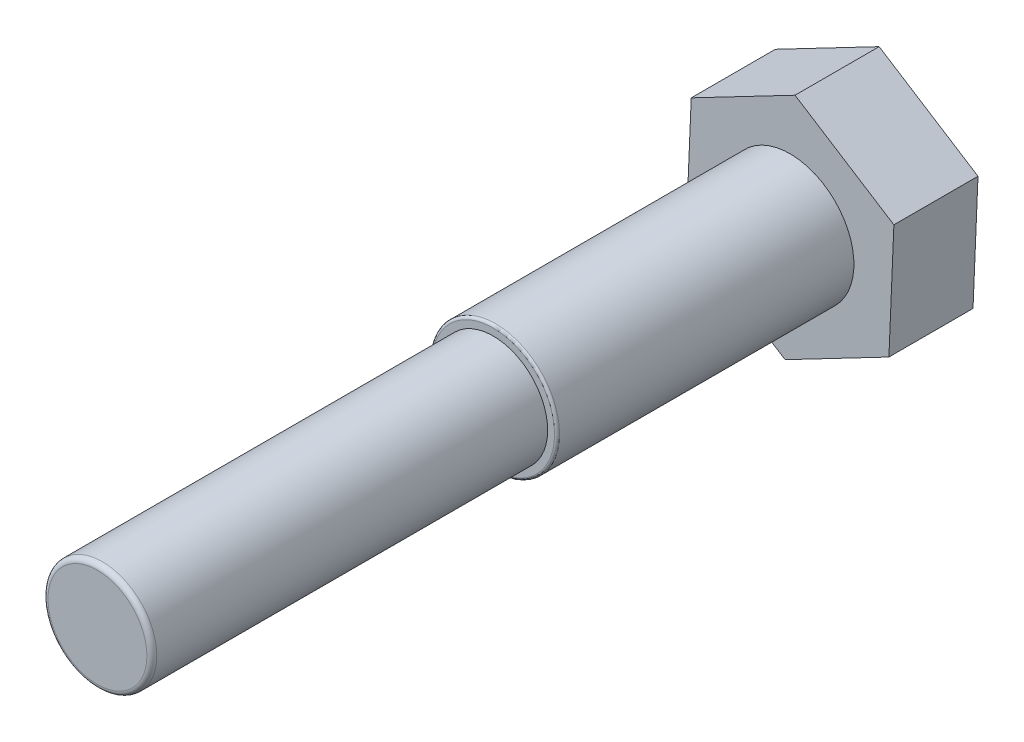
ISO-10303-21;
HEADER;
FILE_DESCRIPTION(('STEP AP214'),'2;1');
FILE_NAME('part.step','',(''),(''),'','','');
FILE_SCHEMA(('AUTOMOTIVE_DESIGN { 1 0 10303 214 1 1 1 1 }'));
ENDSEC;
DATA;
#1=APPLICATION_CONTEXT('core data for automotive mechanical design processes');
#2=APPLICATION_PROTOCOL_DEFINITION('international standard','automotive_design',2000,#1);
#3=PRODUCT_CONTEXT('',#1,'mechanical');
#4=PRODUCT('Part','Part','',(#3));
#5=PRODUCT_RELATED_PRODUCT_CATEGORY('part','',(#4));
#6=PRODUCT_DEFINITION_FORMATION('','',#4);
#7=PRODUCT_DEFINITION_CONTEXT('part definition',#1,'design');
#8=PRODUCT_DEFINITION('design','',#6,#7);
#9=PRODUCT_DEFINITION_SHAPE('','',#8);
#10=(LENGTH_UNIT() NAMED_UNIT(*) SI_UNIT(.MILLI.,.METRE.));
#11=(NAMED_UNIT(*) PLANE_ANGLE_UNIT() SI_UNIT($,.RADIAN.));
#12=(NAMED_UNIT(*) SI_UNIT($,.STERADIAN.) SOLID_ANGLE_UNIT());
#13=UNCERTAINTY_MEASURE_WITH_UNIT(LENGTH_MEASURE(1.E-05),#10,'distance_accuracy_value','');
#14=(GEOMETRIC_REPRESENTATION_CONTEXT(3) GLOBAL_UNCERTAINTY_ASSIGNED_CONTEXT((#13)) GLOBAL_UNIT_ASSIGNED_CONTEXT((#10,
#11,#12)) REPRESENTATION_CONTEXT('',''));
#15=CARTESIAN_POINT('',(0.,0.,0.));
#16=DIRECTION('',(0.,0.,1.));
#17=DIRECTION('',(1.,0.,0.));
#18=AXIS2_PLACEMENT_3D('',#15,#16,#17);
#19=CARTESIAN_POINT('',(19.9787997617734,-12.6957037383635,17.));
#20=DIRECTION('',(-0.999097599975706,0.0424733530909036,0.));
#21=DIRECTION('',(-0.0424733530909036,-0.999097599975706,0.));
#22=AXIS2_PLACEMENT_3D('',#19,#20,#21);
#23=PLANE('',#22);
#24=DIRECTION('',(0.0424733530909036,0.999097599975706,0.));
#25=VECTOR('',#24,1.);
#26=CARTESIAN_POINT('',(19.9787997617734,-12.6957037383635,0.));
#27=LINE('',#26,#25);
#28=CARTESIAN_POINT('',(19.9787997617734,-12.6957037383635,0.));
#29=VERTEX_POINT('',#28);
#30=CARTESIAN_POINT('',(20.9842018372306,10.9542962616365,0.));
#31=VERTEX_POINT('',#30);
#32=EDGE_CURVE('E122',#29,#31,#27,.T.);
#33=ORIENTED_EDGE('',*,*,#32,.T.);
#34=DIRECTION('',(0.,0.,-1.));
#35=VECTOR('',#34,1.);
#36=CARTESIAN_POINT('',(20.9842018372306,10.9542962616365,17.));
#37=LINE('',#36,#35);
#38=CARTESIAN_POINT('',(20.9842018372306,10.9542962616365,17.));
#39=VERTEX_POINT('',#38);
#40=EDGE_CURVE('E140',#39,#31,#37,.T.);
#41=ORIENTED_EDGE('',*,*,#40,.F.);
#42=DIRECTION('',(0.0424733530909036,0.999097599975706,0.));
#43=VECTOR('',#42,1.);
#44=CARTESIAN_POINT('',(19.9787997617734,-12.6957037383635,17.));
#45=LINE('',#44,#43);
#46=CARTESIAN_POINT('',(19.9787997617734,-12.6957037383635,17.));
#47=VERTEX_POINT('',#46);
#48=EDGE_CURVE('E133',#47,#39,#45,.T.);
#49=ORIENTED_EDGE('',*,*,#48,.F.);
#50=DIRECTION('',(0.,0.,-1.));
#51=VECTOR('',#50,1.);
#52=CARTESIAN_POINT('',(19.9787997617734,-12.6957037383635,17.));
#53=LINE('',#52,#51);
#54=EDGE_CURVE('E118',#47,#29,#53,.T.);
#55=ORIENTED_EDGE('',*,*,#54,.T.);
#56=EDGE_LOOP('',(#33,#41,#49,#55));
#57=FACE_BOUND('',#56,.T.);
#58=ADVANCED_FACE('F36',(#57),#23,.F.);
#59=CARTESIAN_POINT('',(20.9842018372306,10.9542962616365,17.));
#60=DIRECTION('',(-0.536331802748482,-0.844007225893572,0.));
#61=DIRECTION('',(0.844007225893572,-0.536331802748482,0.));
#62=AXIS2_PLACEMENT_3D('',#59,#60,#61);
#63=PLANE('',#62);
#64=DIRECTION('',(-0.844007225893572,0.536331802748482,0.));
#65=VECTOR('',#64,1.);
#66=CARTESIAN_POINT('',(20.9842018372306,10.9542962616365,0.));
#67=LINE('',#66,#65);
#68=CARTESIAN_POINT('',(1.0054020754572,23.65,0.));
#69=VERTEX_POINT('',#68);
#70=EDGE_CURVE('E125',#31,#69,#67,.T.);
#71=ORIENTED_EDGE('',*,*,#70,.T.);
#72=DIRECTION('',(0.,0.,-1.));
#73=VECTOR('',#72,1.);
#74=CARTESIAN_POINT('',(1.0054020754572,23.65,17.));
#75=LINE('',#74,#73);
#76=CARTESIAN_POINT('',(1.0054020754572,23.65,17.));
#77=VERTEX_POINT('',#76);
#78=EDGE_CURVE('E137',#77,#69,#75,.T.);
#79=ORIENTED_EDGE('',*,*,#78,.F.);
#80=DIRECTION('',(-0.844007225893572,0.536331802748482,0.));
#81=VECTOR('',#80,1.);
#82=CARTESIAN_POINT('',(20.9842018372306,10.9542962616365,17.));
#83=LINE('',#82,#81);
#84=EDGE_CURVE('E91',#39,#77,#83,.T.);
#85=ORIENTED_EDGE('',*,*,#84,.F.);
#86=ORIENTED_EDGE('',*,*,#40,.T.);
#87=EDGE_LOOP('',(#71,#79,#85,#86));
#88=FACE_BOUND('',#87,.T.);
#89=ADVANCED_FACE('F166',(#88),#63,.F.);
#90=CARTESIAN_POINT('',(1.0054020754572,23.65,17.));
#91=DIRECTION('',(0.462765797227231,-0.886480578984472,0.));
#92=DIRECTION('',(0.886480578984472,0.462765797227231,0.));
#93=AXIS2_PLACEMENT_3D('',#90,#91,#92);
#94=PLANE('',#93);
#95=DIRECTION('',(-0.886480578984472,-0.462765797227231,0.));
#96=VECTOR('',#95,1.);
#97=CARTESIAN_POINT('',(1.0054020754572,23.65,0.));
#98=LINE('',#97,#96);
#99=CARTESIAN_POINT('',(-19.9787997617736,12.6957037383632,0.));
#100=VERTEX_POINT('',#99);
#101=EDGE_CURVE('E128',#69,#100,#98,.T.);
#102=ORIENTED_EDGE('',*,*,#101,.T.);
#103=DIRECTION('',(0.,0.,-1.));
#104=VECTOR('',#103,1.);
#105=CARTESIAN_POINT('',(-19.9787997617736,12.6957037383632,17.));
#106=LINE('',#105,#104);
#107=CARTESIAN_POINT('',(-19.9787997617736,12.6957037383632,17.));
#108=VERTEX_POINT('',#107);
#109=EDGE_CURVE('E113',#108,#100,#106,.T.);
#110=ORIENTED_EDGE('',*,*,#109,.F.);
#111=DIRECTION('',(-0.886480578984472,-0.462765797227231,0.));
#112=VECTOR('',#111,1.);
#113=CARTESIAN_POINT('',(1.0054020754572,23.65,17.));
#114=LINE('',#113,#112);
#115=EDGE_CURVE('E104',#77,#108,#114,.T.);
#116=ORIENTED_EDGE('',*,*,#115,.F.);
#117=ORIENTED_EDGE('',*,*,#78,.T.);
#118=EDGE_LOOP('',(#102,#110,#116,#117));
#119=FACE_BOUND('',#118,.T.);
#120=ADVANCED_FACE('F172',(#119),#94,.F.);
#121=CARTESIAN_POINT('',(-19.9787997617736,12.6957037383632,17.));
#122=DIRECTION('',(0.999097599975706,-0.0424733530908878,0.));
#123=DIRECTION('',(0.0424733530908878,0.999097599975707,0.));
#124=AXIS2_PLACEMENT_3D('',#121,#122,#123);
#125=PLANE('',#124);
#126=DIRECTION('',(-0.0424733530908878,-0.999097599975706,0.));
#127=VECTOR('',#126,1.);
#128=CARTESIAN_POINT('',(-19.9787997617736,12.6957037383632,0.));
#129=LINE('',#128,#127);
#130=CARTESIAN_POINT('',(-20.9842018372304,-10.9542962616368,0.));
#131=VERTEX_POINT('',#130);
#132=EDGE_CURVE('E112',#100,#131,#129,.T.);
#133=ORIENTED_EDGE('',*,*,#132,.T.);
#134=DIRECTION('',(0.,0.,-1.));
#135=VECTOR('',#134,1.);
#136=CARTESIAN_POINT('',(-20.9842018372304,-10.9542962616368,17.));
#137=LINE('',#136,#135);
#138=CARTESIAN_POINT('',(-20.9842018372304,-10.9542962616368,17.));
#139=VERTEX_POINT('',#138);
#140=EDGE_CURVE('E109',#139,#131,#137,.T.);
#141=ORIENTED_EDGE('',*,*,#140,.F.);
#142=DIRECTION('',(-0.0424733530908878,-0.999097599975706,0.));
#143=VECTOR('',#142,1.);
#144=CARTESIAN_POINT('',(-19.9787997617736,12.6957037383632,17.));
#145=LINE('',#144,#143);
#146=EDGE_CURVE('E98',#108,#139,#145,.T.);
#147=ORIENTED_EDGE('',*,*,#146,.F.);
#148=ORIENTED_EDGE('',*,*,#109,.T.);
#149=EDGE_LOOP('',(#133,#141,#147,#148));
#150=FACE_BOUND('',#149,.T.);
#151=ADVANCED_FACE('F110',(#150),#125,.F.);
#152=CARTESIAN_POINT('',(-20.9842018372304,-10.9542962616368,17.));
#153=DIRECTION('',(0.536331802748476,0.844007225893576,0.));
#154=DIRECTION('',(-0.844007225893576,0.536331802748476,0.));
#155=AXIS2_PLACEMENT_3D('',#152,#153,#154);
#156=PLANE('',#155);
#157=DIRECTION('',(0.844007225893576,-0.536331802748476,0.));
#158=VECTOR('',#157,1.);
#159=CARTESIAN_POINT('',(-20.9842018372304,-10.9542962616368,0.));
#160=LINE('',#159,#158);
#161=CARTESIAN_POINT('',(-1.00540207545719,-23.65,0.));
#162=VERTEX_POINT('',#161);
#163=EDGE_CURVE('E76',#131,#162,#160,.T.);
#164=ORIENTED_EDGE('',*,*,#163,.T.);
#165=DIRECTION('',(0.,0.,-1.));
#166=VECTOR('',#165,1.);
#167=CARTESIAN_POINT('',(-1.00540207545719,-23.65,17.));
#168=LINE('',#167,#166);
#169=CARTESIAN_POINT('',(-1.00540207545719,-23.65,17.));
#170=VERTEX_POINT('',#169);
#171=EDGE_CURVE('E114',#170,#162,#168,.T.);
#172=ORIENTED_EDGE('',*,*,#171,.F.);
#173=DIRECTION('',(0.844007225893576,-0.536331802748476,0.));
#174=VECTOR('',#173,1.);
#175=CARTESIAN_POINT('',(-20.9842018372304,-10.9542962616368,17.));
#176=LINE('',#175,#174);
#177=EDGE_CURVE('E102',#139,#170,#176,.T.);
#178=ORIENTED_EDGE('',*,*,#177,.F.);
#179=ORIENTED_EDGE('',*,*,#140,.T.);
#180=EDGE_LOOP('',(#164,#172,#178,#179));
#181=FACE_BOUND('',#180,.T.);
#182=ADVANCED_FACE('F116',(#181),#156,.F.);
#183=CARTESIAN_POINT('',(-1.00540207545719,-23.65,17.));
#184=DIRECTION('',(-0.462765797227224,0.886480578984476,0.));
#185=DIRECTION('',(-0.886480578984476,-0.462765797227224,0.));
#186=AXIS2_PLACEMENT_3D('',#183,#184,#185);
#187=PLANE('',#186);
#188=DIRECTION('',(0.886480578984476,0.462765797227224,0.));
#189=VECTOR('',#188,1.);
#190=CARTESIAN_POINT('',(-1.00540207545719,-23.65,0.));
#191=LINE('',#190,#189);
#192=EDGE_CURVE('E82',#162,#29,#191,.T.);
#193=ORIENTED_EDGE('',*,*,#192,.T.);
#194=ORIENTED_EDGE('',*,*,#54,.F.);
#195=DIRECTION('',(0.886480578984476,0.462765797227224,0.));
#196=VECTOR('',#195,1.);
#197=CARTESIAN_POINT('',(-1.00540207545719,-23.65,17.));
#198=LINE('',#197,#196);
#199=EDGE_CURVE('E53',#170,#47,#198,.T.);
#200=ORIENTED_EDGE('',*,*,#199,.F.);
#201=ORIENTED_EDGE('',*,*,#171,.T.);
#202=EDGE_LOOP('',(#193,#194,#200,#201));
#203=FACE_BOUND('',#202,.T.);
#204=ADVANCED_FACE('F182',(#203),#187,.F.);
#205=CARTESIAN_POINT('',(18.9733976863162,-36.3457037383633,17.));
#206=DIRECTION('',(0.,0.,-1.));
#207=DIRECTION('',(-1.,0.,0.));
#208=AXIS2_PLACEMENT_3D('',#205,#206,#207);
#209=PLANE('',#208);
#210=CARTESIAN_POINT('',(0.,0.,17.));
#211=DIRECTION('',(0.,0.,-1.));
#212=DIRECTION('',(-1.,0.,0.));
#213=AXIS2_PLACEMENT_3D('',#210,#211,#212);
#214=CIRCLE('',#213,12.9);
#215=CARTESIAN_POINT('',(-12.9,0.,17.));
#216=VERTEX_POINT('',#215);
#217=EDGE_CURVE('E142',#216,#216,#214,.F.);
#218=ORIENTED_EDGE('',*,*,#217,.F.);
#219=EDGE_LOOP('',(#218));
#220=FACE_BOUND('',#219,.T.);
#221=ORIENTED_EDGE('',*,*,#48,.T.);
#222=ORIENTED_EDGE('',*,*,#84,.T.);
#223=ORIENTED_EDGE('',*,*,#115,.T.);
#224=ORIENTED_EDGE('',*,*,#146,.T.);
#225=ORIENTED_EDGE('',*,*,#177,.T.);
#226=ORIENTED_EDGE('',*,*,#199,.T.);
#227=EDGE_LOOP('',(#221,#222,#223,#224,#225,#226));
#228=FACE_BOUND('',#227,.T.);
#229=ADVANCED_FACE('F100',(#220,#228),#209,.F.);
#230=CARTESIAN_POINT('',(18.9733976863162,-36.3457037383633,0.));
#231=DIRECTION('',(0.,0.,-1.));
#232=DIRECTION('',(-1.,0.,0.));
#233=AXIS2_PLACEMENT_3D('',#230,#231,#232);
#234=PLANE('',#233);
#235=ORIENTED_EDGE('',*,*,#32,.F.);
#236=ORIENTED_EDGE('',*,*,#192,.F.);
#237=ORIENTED_EDGE('',*,*,#163,.F.);
#238=ORIENTED_EDGE('',*,*,#132,.F.);
#239=ORIENTED_EDGE('',*,*,#101,.F.);
#240=ORIENTED_EDGE('',*,*,#70,.F.);
#241=EDGE_LOOP('',(#235,#236,#237,#238,#239,#240));
#242=FACE_BOUND('',#241,.T.);
#243=ADVANCED_FACE('F185',(#242),#234,.T.);
#244=CARTESIAN_POINT('',(0.,0.,77.));
#245=DIRECTION('',(0.,0.,-1.));
#246=DIRECTION('',(-1.,0.,0.));
#247=AXIS2_PLACEMENT_3D('',#244,#245,#246);
#248=CYLINDRICAL_SURFACE('',#247,12.9);
#249=CARTESIAN_POINT('',(0.,0.,76.5));
#250=DIRECTION('',(0.,0.,1.));
#251=DIRECTION('',(1.,0.,0.));
#252=AXIS2_PLACEMENT_3D('',#249,#250,#251);
#253=CIRCLE('',#252,12.9);
#254=CARTESIAN_POINT('',(12.9,0.,76.5));
#255=VERTEX_POINT('',#254);
#256=EDGE_CURVE('E11',#255,#255,#253,.F.);
#257=ORIENTED_EDGE('',*,*,#256,.T.);
#258=EDGE_LOOP('',(#257));
#259=FACE_BOUND('',#258,.T.);
#260=ORIENTED_EDGE('',*,*,#217,.T.);
#261=EDGE_LOOP('',(#260));
#262=FACE_BOUND('',#261,.T.);
#263=ADVANCED_FACE('F188',(#259,#262),#248,.T.);
#264=CARTESIAN_POINT('',(0.,0.,77.));
#265=DIRECTION('',(0.,0.,1.));
#266=DIRECTION('',(1.,0.,0.));
#267=AXIS2_PLACEMENT_3D('',#264,#265,#266);
#268=PLANE('',#267);
#269=CARTESIAN_POINT('',(0.,0.,77.));
#270=DIRECTION('',(0.,0.,1.));
#271=DIRECTION('',(1.,0.,0.));
#272=AXIS2_PLACEMENT_3D('',#269,#270,#271);
#273=CIRCLE('',#272,12.4);
#274=CARTESIAN_POINT('',(12.4,0.,77.));
#275=VERTEX_POINT('',#274);
#276=EDGE_CURVE('E45',#275,#275,#273,.T.);
#277=ORIENTED_EDGE('',*,*,#276,.T.);
#278=EDGE_LOOP('',(#277));
#279=FACE_BOUND('',#278,.T.);
#280=CARTESIAN_POINT('',(0.,0.,77.));
#281=DIRECTION('',(0.,0.,1.));
#282=DIRECTION('',(1.,0.,0.));
#283=AXIS2_PLACEMENT_3D('',#280,#281,#282);
#284=CIRCLE('',#283,11.);
#285=CARTESIAN_POINT('',(11.,0.,77.));
#286=VERTEX_POINT('',#285);
#287=EDGE_CURVE('E126',#286,#286,#284,.T.);
#288=ORIENTED_EDGE('',*,*,#287,.F.);
#289=EDGE_LOOP('',(#288));
#290=FACE_BOUND('',#289,.T.);
#291=ADVANCED_FACE('F153',(#279,#290),#268,.T.);
#292=CARTESIAN_POINT('',(0.,0.,157.));
#293=DIRECTION('',(0.,0.,-1.));
#294=DIRECTION('',(-1.,0.,0.));
#295=AXIS2_PLACEMENT_3D('',#292,#293,#294);
#296=CYLINDRICAL_SURFACE('',#295,11.);
#297=CARTESIAN_POINT('',(0.,0.,156.));
#298=DIRECTION('',(0.,0.,1.));
#299=DIRECTION('',(1.,0.,0.));
#300=AXIS2_PLACEMENT_3D('',#297,#298,#299);
#301=CIRCLE('',#300,11.);
#302=CARTESIAN_POINT('',(11.,0.,156.));
#303=VERTEX_POINT('',#302);
#304=EDGE_CURVE('E148',#303,#303,#301,.F.);
#305=ORIENTED_EDGE('',*,*,#304,.T.);
#306=EDGE_LOOP('',(#305));
#307=FACE_BOUND('',#306,.T.);
#308=ORIENTED_EDGE('',*,*,#287,.T.);
#309=EDGE_LOOP('',(#308));
#310=FACE_BOUND('',#309,.T.);
#311=ADVANCED_FACE('F198',(#307,#310),#296,.T.);
#312=CARTESIAN_POINT('',(0.,0.,157.));
#313=DIRECTION('',(0.,0.,1.));
#314=DIRECTION('',(1.,0.,0.));
#315=AXIS2_PLACEMENT_3D('',#312,#313,#314);
#316=PLANE('',#315);
#317=CARTESIAN_POINT('',(0.,0.,157.));
#318=DIRECTION('',(0.,0.,1.));
#319=DIRECTION('',(1.,0.,0.));
#320=AXIS2_PLACEMENT_3D('',#317,#318,#319);
#321=CIRCLE('',#320,10.);
#322=CARTESIAN_POINT('',(10.,0.,157.));
#323=VERTEX_POINT('',#322);
#324=EDGE_CURVE('E145',#323,#323,#321,.T.);
#325=ORIENTED_EDGE('',*,*,#324,.T.);
#326=EDGE_LOOP('',(#325));
#327=FACE_BOUND('',#326,.T.);
#328=ADVANCED_FACE('F162',(#327),#316,.T.);
#329=CARTESIAN_POINT('',(0.,0.,156.));
#330=DIRECTION('',(0.,0.,1.));
#331=DIRECTION('',(1.,0.,0.));
#332=AXIS2_PLACEMENT_3D('',#329,#330,#331);
#333=TOROIDAL_SURFACE('',#332,10.,1.);
#334=ORIENTED_EDGE('',*,*,#304,.F.);
#335=EDGE_LOOP('',(#334));
#336=FACE_BOUND('',#335,.T.);
#337=ORIENTED_EDGE('',*,*,#324,.F.);
#338=EDGE_LOOP('',(#337));
#339=FACE_BOUND('',#338,.T.);
#340=ADVANCED_FACE('F157',(#336,#339),#333,.T.);
#341=CARTESIAN_POINT('',(0.,0.,76.5));
#342=DIRECTION('',(0.,0.,1.));
#343=DIRECTION('',(1.,0.,0.));
#344=AXIS2_PLACEMENT_3D('',#341,#342,#343);
#345=TOROIDAL_SURFACE('',#344,12.4,0.5);
#346=ORIENTED_EDGE('',*,*,#256,.F.);
#347=EDGE_LOOP('',(#346));
#348=FACE_BOUND('',#347,.T.);
#349=ORIENTED_EDGE('',*,*,#276,.F.);
#350=EDGE_LOOP('',(#349));
#351=FACE_BOUND('',#350,.T.);
#352=ADVANCED_FACE('F38',(#348,#351),#345,.T.);
#353=CLOSED_SHELL('',(#58,#89,#120,#151,#182,#204,#229,#243,#263,#291,#311,#328,#340,#352));
#354=MANIFOLD_SOLID_BREP('B2',#353);
#355=ADVANCED_BREP_SHAPE_REPRESENTATION('',(#18,#354),#14);
#356=SHAPE_DEFINITION_REPRESENTATION(#9,#355);
ENDSEC;
END-ISO-10303-21;
